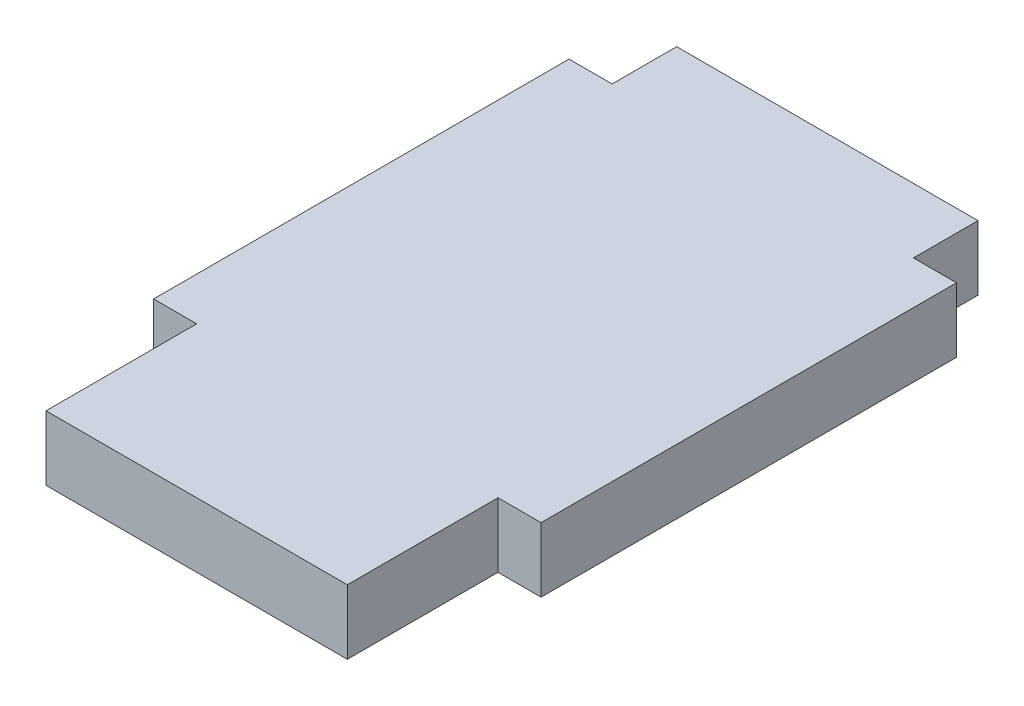
ISO-10303-21;
HEADER;
FILE_DESCRIPTION(('STEP AP214'),'2;1');
FILE_NAME('part.step','',(''),(''),'','','');
FILE_SCHEMA(('AUTOMOTIVE_DESIGN { 1 0 10303 214 1 1 1 1 }'));
ENDSEC;
DATA;
#1=APPLICATION_CONTEXT('core data for automotive mechanical design processes');
#2=APPLICATION_PROTOCOL_DEFINITION('international standard','automotive_design',2000,#1);
#3=PRODUCT_CONTEXT('',#1,'mechanical');
#4=PRODUCT('Part','Part','',(#3));
#5=PRODUCT_RELATED_PRODUCT_CATEGORY('part','',(#4));
#6=PRODUCT_DEFINITION_FORMATION('','',#4);
#7=PRODUCT_DEFINITION_CONTEXT('part definition',#1,'design');
#8=PRODUCT_DEFINITION('design','',#6,#7);
#9=PRODUCT_DEFINITION_SHAPE('','',#8);
#10=(LENGTH_UNIT() NAMED_UNIT(*) SI_UNIT(.MILLI.,.METRE.));
#11=(NAMED_UNIT(*) PLANE_ANGLE_UNIT() SI_UNIT($,.RADIAN.));
#12=(NAMED_UNIT(*) SI_UNIT($,.STERADIAN.) SOLID_ANGLE_UNIT());
#13=UNCERTAINTY_MEASURE_WITH_UNIT(LENGTH_MEASURE(1.E-05),#10,'distance_accuracy_value','');
#14=(GEOMETRIC_REPRESENTATION_CONTEXT(3) GLOBAL_UNCERTAINTY_ASSIGNED_CONTEXT((#13)) GLOBAL_UNIT_ASSIGNED_CONTEXT((#10,
#11,#12)) REPRESENTATION_CONTEXT('',''));
#15=CARTESIAN_POINT('',(0.,0.,0.));
#16=DIRECTION('',(0.,0.,1.));
#17=DIRECTION('',(1.,0.,0.));
#18=AXIS2_PLACEMENT_3D('',#15,#16,#17);
#19=CARTESIAN_POINT('',(-7.,3.,10.434482278096));
#20=DIRECTION('',(0.,0.,1.));
#21=DIRECTION('',(1.,0.,0.));
#22=AXIS2_PLACEMENT_3D('',#19,#20,#21);
#23=PLANE('',#22);
#24=DIRECTION('',(-1.,0.,0.));
#25=VECTOR('',#24,1.);
#26=CARTESIAN_POINT('',(-7.,0.,10.434482278096));
#27=LINE('',#26,#25);
#28=CARTESIAN_POINT('',(-7.,0.,10.434482278096));
#29=VERTEX_POINT('',#28);
#30=CARTESIAN_POINT('',(-9.,0.,10.434482278096));
#31=VERTEX_POINT('',#30);
#32=EDGE_CURVE('E160',#29,#31,#27,.T.);
#33=ORIENTED_EDGE('',*,*,#32,.F.);
#34=DIRECTION('',(0.,-1.,0.));
#35=VECTOR('',#34,1.);
#36=CARTESIAN_POINT('',(-7.,3.,10.434482278096));
#37=LINE('',#36,#35);
#38=CARTESIAN_POINT('',(-7.,3.,10.434482278096));
#39=VERTEX_POINT('',#38);
#40=EDGE_CURVE('E11',#39,#29,#37,.T.);
#41=ORIENTED_EDGE('',*,*,#40,.F.);
#42=DIRECTION('',(-1.,0.,0.));
#43=VECTOR('',#42,1.);
#44=CARTESIAN_POINT('',(-7.,3.,10.434482278096));
#45=LINE('',#44,#43);
#46=CARTESIAN_POINT('',(-9.,3.,10.434482278096));
#47=VERTEX_POINT('',#46);
#48=EDGE_CURVE('E187',#39,#47,#45,.T.);
#49=ORIENTED_EDGE('',*,*,#48,.T.);
#50=DIRECTION('',(0.,-1.,0.));
#51=VECTOR('',#50,1.);
#52=CARTESIAN_POINT('',(-9.,3.,10.434482278096));
#53=LINE('',#52,#51);
#54=EDGE_CURVE('E42',#47,#31,#53,.T.);
#55=ORIENTED_EDGE('',*,*,#54,.T.);
#56=EDGE_LOOP('',(#33,#41,#49,#55));
#57=FACE_BOUND('',#56,.T.);
#58=ADVANCED_FACE('F39',(#57),#23,.T.);
#59=CARTESIAN_POINT('',(-7.,3.,13.434482278096));
#60=DIRECTION('',(-1.,0.,0.));
#61=DIRECTION('',(0.,0.,1.));
#62=AXIS2_PLACEMENT_3D('',#59,#60,#61);
#63=PLANE('',#62);
#64=DIRECTION('',(0.,0.,-1.));
#65=VECTOR('',#64,1.);
#66=CARTESIAN_POINT('',(-7.,0.,13.434482278096));
#67=LINE('',#66,#65);
#68=CARTESIAN_POINT('',(-7.,0.,17.434482278096));
#69=VERTEX_POINT('',#68);
#70=EDGE_CURVE('E185',#69,#29,#67,.T.);
#71=ORIENTED_EDGE('',*,*,#70,.F.);
#72=DIRECTION('',(0.,-1.,0.));
#73=VECTOR('',#72,1.);
#74=CARTESIAN_POINT('',(-7.,3.,17.434482278096));
#75=LINE('',#74,#73);
#76=CARTESIAN_POINT('',(-7.,3.,17.434482278096));
#77=VERTEX_POINT('',#76);
#78=EDGE_CURVE('E212',#77,#69,#75,.T.);
#79=ORIENTED_EDGE('',*,*,#78,.F.);
#80=DIRECTION('',(0.,0.,-1.));
#81=VECTOR('',#80,1.);
#82=CARTESIAN_POINT('',(-7.,3.,13.434482278096));
#83=LINE('',#82,#81);
#84=EDGE_CURVE('E158',#77,#39,#83,.T.);
#85=ORIENTED_EDGE('',*,*,#84,.T.);
#86=ORIENTED_EDGE('',*,*,#40,.T.);
#87=EDGE_LOOP('',(#71,#79,#85,#86));
#88=FACE_BOUND('',#87,.T.);
#89=ADVANCED_FACE('F211',(#88),#63,.T.);
#90=CARTESIAN_POINT('',(7.,3.,13.434482278096));
#91=DIRECTION('',(-1.,0.,0.));
#92=DIRECTION('',(0.,0.,1.));
#93=AXIS2_PLACEMENT_3D('',#90,#91,#92);
#94=PLANE('',#93);
#95=DIRECTION('',(0.,0.,-1.));
#96=VECTOR('',#95,1.);
#97=CARTESIAN_POINT('',(7.,0.,13.434482278096));
#98=LINE('',#97,#96);
#99=CARTESIAN_POINT('',(7.,0.,17.434482278096));
#100=VERTEX_POINT('',#99);
#101=CARTESIAN_POINT('',(7.,0.,10.434482278096));
#102=VERTEX_POINT('',#101);
#103=EDGE_CURVE('E92',#100,#102,#98,.T.);
#104=ORIENTED_EDGE('',*,*,#103,.T.);
#105=DIRECTION('',(0.,-1.,0.));
#106=VECTOR('',#105,1.);
#107=CARTESIAN_POINT('',(7.,3.,10.434482278096));
#108=LINE('',#107,#106);
#109=CARTESIAN_POINT('',(7.,3.,10.434482278096));
#110=VERTEX_POINT('',#109);
#111=EDGE_CURVE('E48',#110,#102,#108,.T.);
#112=ORIENTED_EDGE('',*,*,#111,.F.);
#113=DIRECTION('',(0.,0.,-1.));
#114=VECTOR('',#113,1.);
#115=CARTESIAN_POINT('',(7.,3.,13.434482278096));
#116=LINE('',#115,#114);
#117=CARTESIAN_POINT('',(7.,3.,17.434482278096));
#118=VERTEX_POINT('',#117);
#119=EDGE_CURVE('E136',#118,#110,#116,.T.);
#120=ORIENTED_EDGE('',*,*,#119,.F.);
#121=DIRECTION('',(0.,1.,0.));
#122=VECTOR('',#121,1.);
#123=CARTESIAN_POINT('',(7.,3.,17.434482278096));
#124=LINE('',#123,#122);
#125=EDGE_CURVE('E222',#100,#118,#124,.T.);
#126=ORIENTED_EDGE('',*,*,#125,.F.);
#127=EDGE_LOOP('',(#104,#112,#120,#126));
#128=FACE_BOUND('',#127,.T.);
#129=ADVANCED_FACE('F269',(#128),#94,.F.);
#130=CARTESIAN_POINT('',(7.,3.,10.434482278096));
#131=DIRECTION('',(0.,0.,-1.));
#132=DIRECTION('',(-1.,0.,0.));
#133=AXIS2_PLACEMENT_3D('',#130,#131,#132);
#134=PLANE('',#133);
#135=DIRECTION('',(1.,0.,0.));
#136=VECTOR('',#135,1.);
#137=CARTESIAN_POINT('',(7.,0.,10.434482278096));
#138=LINE('',#137,#136);
#139=CARTESIAN_POINT('',(9.,0.,10.434482278096));
#140=VERTEX_POINT('',#139);
#141=EDGE_CURVE('E143',#102,#140,#138,.T.);
#142=ORIENTED_EDGE('',*,*,#141,.T.);
#143=DIRECTION('',(0.,-1.,0.));
#144=VECTOR('',#143,1.);
#145=CARTESIAN_POINT('',(9.,3.,10.434482278096));
#146=LINE('',#145,#144);
#147=CARTESIAN_POINT('',(9.,3.,10.434482278096));
#148=VERTEX_POINT('',#147);
#149=EDGE_CURVE('E140',#148,#140,#146,.T.);
#150=ORIENTED_EDGE('',*,*,#149,.F.);
#151=DIRECTION('',(1.,0.,0.));
#152=VECTOR('',#151,1.);
#153=CARTESIAN_POINT('',(7.,3.,10.434482278096));
#154=LINE('',#153,#152);
#155=EDGE_CURVE('E127',#110,#148,#154,.T.);
#156=ORIENTED_EDGE('',*,*,#155,.F.);
#157=ORIENTED_EDGE('',*,*,#111,.T.);
#158=EDGE_LOOP('',(#142,#150,#156,#157));
#159=FACE_BOUND('',#158,.T.);
#160=ADVANCED_FACE('F141',(#159),#134,.F.);
#161=CARTESIAN_POINT('',(9.,3.,10.434482278096));
#162=DIRECTION('',(-1.,0.,0.));
#163=DIRECTION('',(0.,0.,1.));
#164=AXIS2_PLACEMENT_3D('',#161,#162,#163);
#165=PLANE('',#164);
#166=DIRECTION('',(0.,0.,-1.));
#167=VECTOR('',#166,1.);
#168=CARTESIAN_POINT('',(9.,0.,10.434482278096));
#169=LINE('',#168,#167);
#170=CARTESIAN_POINT('',(9.,0.,-8.86551772190398));
#171=VERTEX_POINT('',#170);
#172=EDGE_CURVE('E181',#140,#171,#169,.T.);
#173=ORIENTED_EDGE('',*,*,#172,.T.);
#174=DIRECTION('',(0.,-1.,0.));
#175=VECTOR('',#174,1.);
#176=CARTESIAN_POINT('',(9.,3.,-8.86551772190398));
#177=LINE('',#176,#175);
#178=CARTESIAN_POINT('',(9.,3.,-8.86551772190398));
#179=VERTEX_POINT('',#178);
#180=EDGE_CURVE('E147',#179,#171,#177,.T.);
#181=ORIENTED_EDGE('',*,*,#180,.F.);
#182=DIRECTION('',(0.,0.,-1.));
#183=VECTOR('',#182,1.);
#184=CARTESIAN_POINT('',(9.,3.,10.434482278096));
#185=LINE('',#184,#183);
#186=EDGE_CURVE('E132',#148,#179,#185,.T.);
#187=ORIENTED_EDGE('',*,*,#186,.F.);
#188=ORIENTED_EDGE('',*,*,#149,.T.);
#189=EDGE_LOOP('',(#173,#181,#187,#188));
#190=FACE_BOUND('',#189,.T.);
#191=ADVANCED_FACE('F149',(#190),#165,.F.);
#192=CARTESIAN_POINT('',(7.,3.,-8.86551772190398));
#193=DIRECTION('',(0.,0.,-1.));
#194=DIRECTION('',(-1.,0.,0.));
#195=AXIS2_PLACEMENT_3D('',#192,#193,#194);
#196=PLANE('',#195);
#197=DIRECTION('',(1.,0.,0.));
#198=VECTOR('',#197,1.);
#199=CARTESIAN_POINT('',(7.,0.,-8.86551772190398));
#200=LINE('',#199,#198);
#201=CARTESIAN_POINT('',(7.,0.,-8.86551772190398));
#202=VERTEX_POINT('',#201);
#203=EDGE_CURVE('E178',#202,#171,#200,.T.);
#204=ORIENTED_EDGE('',*,*,#203,.F.);
#205=DIRECTION('',(0.,-1.,0.));
#206=VECTOR('',#205,1.);
#207=CARTESIAN_POINT('',(7.,3.,-8.86551772190398));
#208=LINE('',#207,#206);
#209=CARTESIAN_POINT('',(7.,3.,-8.86551772190398));
#210=VERTEX_POINT('',#209);
#211=EDGE_CURVE('E191',#210,#202,#208,.T.);
#212=ORIENTED_EDGE('',*,*,#211,.F.);
#213=DIRECTION('',(1.,0.,0.));
#214=VECTOR('',#213,1.);
#215=CARTESIAN_POINT('',(7.,3.,-8.86551772190398));
#216=LINE('',#215,#214);
#217=EDGE_CURVE('E151',#210,#179,#216,.T.);
#218=ORIENTED_EDGE('',*,*,#217,.T.);
#219=ORIENTED_EDGE('',*,*,#180,.T.);
#220=EDGE_LOOP('',(#204,#212,#218,#219));
#221=FACE_BOUND('',#220,.T.);
#222=ADVANCED_FACE('F255',(#221),#196,.T.);
#223=CARTESIAN_POINT('',(7.,3.,-11.865517721904));
#224=DIRECTION('',(1.,0.,0.));
#225=DIRECTION('',(0.,0.,-1.));
#226=AXIS2_PLACEMENT_3D('',#223,#224,#225);
#227=PLANE('',#226);
#228=DIRECTION('',(0.,0.,1.));
#229=VECTOR('',#228,1.);
#230=CARTESIAN_POINT('',(7.,0.,-11.865517721904));
#231=LINE('',#230,#229);
#232=CARTESIAN_POINT('',(7.,0.,-11.865517721904));
#233=VERTEX_POINT('',#232);
#234=EDGE_CURVE('E175',#233,#202,#231,.T.);
#235=ORIENTED_EDGE('',*,*,#234,.F.);
#236=DIRECTION('',(0.,-1.,0.));
#237=VECTOR('',#236,1.);
#238=CARTESIAN_POINT('',(7.,3.,-11.865517721904));
#239=LINE('',#238,#237);
#240=CARTESIAN_POINT('',(7.,3.,-11.865517721904));
#241=VERTEX_POINT('',#240);
#242=EDGE_CURVE('E193',#241,#233,#239,.T.);
#243=ORIENTED_EDGE('',*,*,#242,.F.);
#244=DIRECTION('',(0.,0.,1.));
#245=VECTOR('',#244,1.);
#246=CARTESIAN_POINT('',(7.,3.,-11.865517721904));
#247=LINE('',#246,#245);
#248=EDGE_CURVE('E153',#241,#210,#247,.T.);
#249=ORIENTED_EDGE('',*,*,#248,.T.);
#250=ORIENTED_EDGE('',*,*,#211,.T.);
#251=EDGE_LOOP('',(#235,#243,#249,#250));
#252=FACE_BOUND('',#251,.T.);
#253=ADVANCED_FACE('F240',(#252),#227,.T.);
#254=CARTESIAN_POINT('',(-7.,3.,-11.865517721904));
#255=DIRECTION('',(0.,0.,-1.));
#256=DIRECTION('',(-1.,0.,0.));
#257=AXIS2_PLACEMENT_3D('',#254,#255,#256);
#258=PLANE('',#257);
#259=DIRECTION('',(1.,0.,0.));
#260=VECTOR('',#259,1.);
#261=CARTESIAN_POINT('',(-7.,0.,-11.865517721904));
#262=LINE('',#261,#260);
#263=CARTESIAN_POINT('',(-7.,0.,-11.865517721904));
#264=VERTEX_POINT('',#263);
#265=EDGE_CURVE('E172',#264,#233,#262,.T.);
#266=ORIENTED_EDGE('',*,*,#265,.F.);
#267=DIRECTION('',(0.,-1.,0.));
#268=VECTOR('',#267,1.);
#269=CARTESIAN_POINT('',(-7.,3.,-11.865517721904));
#270=LINE('',#269,#268);
#271=CARTESIAN_POINT('',(-7.,3.,-11.865517721904));
#272=VERTEX_POINT('',#271);
#273=EDGE_CURVE('E195',#272,#264,#270,.T.);
#274=ORIENTED_EDGE('',*,*,#273,.F.);
#275=DIRECTION('',(1.,0.,0.));
#276=VECTOR('',#275,1.);
#277=CARTESIAN_POINT('',(-7.,3.,-11.865517721904));
#278=LINE('',#277,#276);
#279=EDGE_CURVE('E234',#272,#241,#278,.T.);
#280=ORIENTED_EDGE('',*,*,#279,.T.);
#281=ORIENTED_EDGE('',*,*,#242,.T.);
#282=EDGE_LOOP('',(#266,#274,#280,#281));
#283=FACE_BOUND('',#282,.T.);
#284=ADVANCED_FACE('F245',(#283),#258,.T.);
#285=CARTESIAN_POINT('',(-7.,3.,-11.865517721904));
#286=DIRECTION('',(1.,0.,0.));
#287=DIRECTION('',(0.,0.,-1.));
#288=AXIS2_PLACEMENT_3D('',#285,#286,#287);
#289=PLANE('',#288);
#290=DIRECTION('',(0.,0.,1.));
#291=VECTOR('',#290,1.);
#292=CARTESIAN_POINT('',(-7.,0.,-11.865517721904));
#293=LINE('',#292,#291);
#294=CARTESIAN_POINT('',(-7.,0.,-8.86551772190398));
#295=VERTEX_POINT('',#294);
#296=EDGE_CURVE('E170',#264,#295,#293,.T.);
#297=ORIENTED_EDGE('',*,*,#296,.T.);
#298=DIRECTION('',(0.,-1.,0.));
#299=VECTOR('',#298,1.);
#300=CARTESIAN_POINT('',(-7.,3.,-8.86551772190398));
#301=LINE('',#300,#299);
#302=CARTESIAN_POINT('',(-7.,3.,-8.86551772190398));
#303=VERTEX_POINT('',#302);
#304=EDGE_CURVE('E197',#303,#295,#301,.T.);
#305=ORIENTED_EDGE('',*,*,#304,.F.);
#306=DIRECTION('',(0.,0.,1.));
#307=VECTOR('',#306,1.);
#308=CARTESIAN_POINT('',(-7.,3.,-11.865517721904));
#309=LINE('',#308,#307);
#310=EDGE_CURVE('E232',#272,#303,#309,.T.);
#311=ORIENTED_EDGE('',*,*,#310,.F.);
#312=ORIENTED_EDGE('',*,*,#273,.T.);
#313=EDGE_LOOP('',(#297,#305,#311,#312));
#314=FACE_BOUND('',#313,.T.);
#315=ADVANCED_FACE('F250',(#314),#289,.F.);
#316=CARTESIAN_POINT('',(-7.,3.,-8.86551772190398));
#317=DIRECTION('',(0.,0.,1.));
#318=DIRECTION('',(1.,0.,0.));
#319=AXIS2_PLACEMENT_3D('',#316,#317,#318);
#320=PLANE('',#319);
#321=DIRECTION('',(-1.,0.,0.));
#322=VECTOR('',#321,1.);
#323=CARTESIAN_POINT('',(-7.,0.,-8.86551772190398));
#324=LINE('',#323,#322);
#325=CARTESIAN_POINT('',(-9.,0.,-8.86551772190398));
#326=VERTEX_POINT('',#325);
#327=EDGE_CURVE('E167',#295,#326,#324,.T.);
#328=ORIENTED_EDGE('',*,*,#327,.T.);
#329=DIRECTION('',(0.,-1.,0.));
#330=VECTOR('',#329,1.);
#331=CARTESIAN_POINT('',(-9.,3.,-8.86551772190398));
#332=LINE('',#331,#330);
#333=CARTESIAN_POINT('',(-9.,3.,-8.86551772190398));
#334=VERTEX_POINT('',#333);
#335=EDGE_CURVE('E199',#334,#326,#332,.T.);
#336=ORIENTED_EDGE('',*,*,#335,.F.);
#337=DIRECTION('',(-1.,0.,0.));
#338=VECTOR('',#337,1.);
#339=CARTESIAN_POINT('',(-7.,3.,-8.86551772190398));
#340=LINE('',#339,#338);
#341=EDGE_CURVE('E230',#303,#334,#340,.T.);
#342=ORIENTED_EDGE('',*,*,#341,.F.);
#343=ORIENTED_EDGE('',*,*,#304,.T.);
#344=EDGE_LOOP('',(#328,#336,#342,#343));
#345=FACE_BOUND('',#344,.T.);
#346=ADVANCED_FACE('F253',(#345),#320,.F.);
#347=CARTESIAN_POINT('',(-9.,3.,10.434482278096));
#348=DIRECTION('',(-1.,0.,0.));
#349=DIRECTION('',(0.,0.,1.));
#350=AXIS2_PLACEMENT_3D('',#347,#348,#349);
#351=PLANE('',#350);
#352=DIRECTION('',(0.,0.,-1.));
#353=VECTOR('',#352,1.);
#354=CARTESIAN_POINT('',(-9.,0.,10.434482278096));
#355=LINE('',#354,#353);
#356=EDGE_CURVE('E163',#31,#326,#355,.T.);
#357=ORIENTED_EDGE('',*,*,#356,.F.);
#358=ORIENTED_EDGE('',*,*,#54,.F.);
#359=DIRECTION('',(0.,0.,-1.));
#360=VECTOR('',#359,1.);
#361=CARTESIAN_POINT('',(-9.,3.,10.434482278096));
#362=LINE('',#361,#360);
#363=EDGE_CURVE('E228',#47,#334,#362,.T.);
#364=ORIENTED_EDGE('',*,*,#363,.T.);
#365=ORIENTED_EDGE('',*,*,#335,.T.);
#366=EDGE_LOOP('',(#357,#358,#364,#365));
#367=FACE_BOUND('',#366,.T.);
#368=ADVANCED_FACE('F201',(#367),#351,.T.);
#369=CARTESIAN_POINT('',(0.,3.,0.));
#370=DIRECTION('',(0.,-1.,0.));
#371=DIRECTION('',(0.,0.,-1.));
#372=AXIS2_PLACEMENT_3D('',#369,#370,#371);
#373=PLANE('',#372);
#374=ORIENTED_EDGE('',*,*,#48,.F.);
#375=ORIENTED_EDGE('',*,*,#84,.F.);
#376=DIRECTION('',(-1.,0.,0.));
#377=VECTOR('',#376,1.);
#378=CARTESIAN_POINT('',(-7.,3.,17.434482278096));
#379=LINE('',#378,#377);
#380=EDGE_CURVE('E164',#118,#77,#379,.T.);
#381=ORIENTED_EDGE('',*,*,#380,.F.);
#382=ORIENTED_EDGE('',*,*,#119,.T.);
#383=ORIENTED_EDGE('',*,*,#155,.T.);
#384=ORIENTED_EDGE('',*,*,#186,.T.);
#385=ORIENTED_EDGE('',*,*,#217,.F.);
#386=ORIENTED_EDGE('',*,*,#248,.F.);
#387=ORIENTED_EDGE('',*,*,#279,.F.);
#388=ORIENTED_EDGE('',*,*,#310,.T.);
#389=ORIENTED_EDGE('',*,*,#341,.T.);
#390=ORIENTED_EDGE('',*,*,#363,.F.);
#391=EDGE_LOOP('',(#374,#375,#381,#382,#383,#384,#385,#386,#387,#388,#389,#390));
#392=FACE_BOUND('',#391,.T.);
#393=ADVANCED_FACE('F129',(#392),#373,.F.);
#394=CARTESIAN_POINT('',(0.,0.,0.));
#395=DIRECTION('',(0.,-1.,0.));
#396=DIRECTION('',(0.,0.,-1.));
#397=AXIS2_PLACEMENT_3D('',#394,#395,#396);
#398=PLANE('',#397);
#399=ORIENTED_EDGE('',*,*,#32,.T.);
#400=ORIENTED_EDGE('',*,*,#356,.T.);
#401=ORIENTED_EDGE('',*,*,#327,.F.);
#402=ORIENTED_EDGE('',*,*,#296,.F.);
#403=ORIENTED_EDGE('',*,*,#265,.T.);
#404=ORIENTED_EDGE('',*,*,#234,.T.);
#405=ORIENTED_EDGE('',*,*,#203,.T.);
#406=ORIENTED_EDGE('',*,*,#172,.F.);
#407=ORIENTED_EDGE('',*,*,#141,.F.);
#408=ORIENTED_EDGE('',*,*,#103,.F.);
#409=DIRECTION('',(1.,0.,0.));
#410=VECTOR('',#409,1.);
#411=CARTESIAN_POINT('',(-7.,0.,17.434482278096));
#412=LINE('',#411,#410);
#413=EDGE_CURVE('E208',#69,#100,#412,.T.);
#414=ORIENTED_EDGE('',*,*,#413,.F.);
#415=ORIENTED_EDGE('',*,*,#70,.T.);
#416=EDGE_LOOP('',(#399,#400,#401,#402,#403,#404,#405,#406,#407,#408,#414,#415));
#417=FACE_BOUND('',#416,.T.);
#418=ADVANCED_FACE('F204',(#417),#398,.T.);
#419=CARTESIAN_POINT('',(0.,0.,17.434482278096));
#420=DIRECTION('',(0.,0.,1.));
#421=DIRECTION('',(1.,0.,0.));
#422=AXIS2_PLACEMENT_3D('',#419,#420,#421);
#423=PLANE('',#422);
#424=ORIENTED_EDGE('',*,*,#78,.T.);
#425=ORIENTED_EDGE('',*,*,#413,.T.);
#426=ORIENTED_EDGE('',*,*,#125,.T.);
#427=ORIENTED_EDGE('',*,*,#380,.T.);
#428=EDGE_LOOP('',(#424,#425,#426,#427));
#429=FACE_BOUND('',#428,.T.);
#430=ADVANCED_FACE('F221',(#429),#423,.T.);
#431=CLOSED_SHELL('',(#58,#89,#129,#160,#191,#222,#253,#284,#315,#346,#368,#393,#418,#430));
#432=MANIFOLD_SOLID_BREP('B2',#431);
#433=ADVANCED_BREP_SHAPE_REPRESENTATION('',(#18,#432),#14);
#434=SHAPE_DEFINITION_REPRESENTATION(#9,#433);
ENDSEC;
END-ISO-10303-21;
